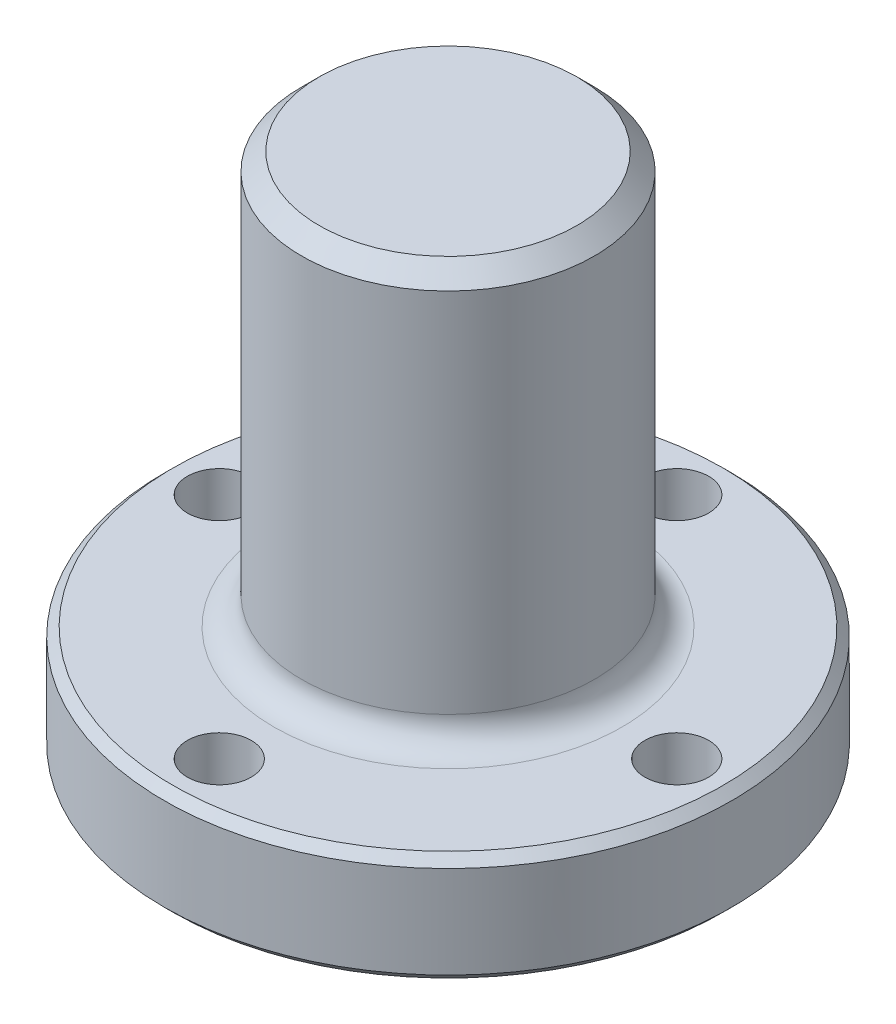
ISO-10303-21;
HEADER;
FILE_DESCRIPTION(('STEP AP214'),'2;1');
FILE_NAME('part.step','',(''),(''),'','','');
FILE_SCHEMA(('AUTOMOTIVE_DESIGN { 1 0 10303 214 1 1 1 1 }'));
ENDSEC;
DATA;
#1=APPLICATION_CONTEXT('core data for automotive mechanical design processes');
#2=APPLICATION_PROTOCOL_DEFINITION('international standard','automotive_design',2000,#1);
#3=PRODUCT_CONTEXT('',#1,'mechanical');
#4=PRODUCT('Part','Part','',(#3));
#5=PRODUCT_RELATED_PRODUCT_CATEGORY('part','',(#4));
#6=PRODUCT_DEFINITION_FORMATION('','',#4);
#7=PRODUCT_DEFINITION_CONTEXT('part definition',#1,'design');
#8=PRODUCT_DEFINITION('design','',#6,#7);
#9=PRODUCT_DEFINITION_SHAPE('','',#8);
#10=(LENGTH_UNIT() NAMED_UNIT(*) SI_UNIT(.MILLI.,.METRE.));
#11=(NAMED_UNIT(*) PLANE_ANGLE_UNIT() SI_UNIT($,.RADIAN.));
#12=(NAMED_UNIT(*) SI_UNIT($,.STERADIAN.) SOLID_ANGLE_UNIT());
#13=UNCERTAINTY_MEASURE_WITH_UNIT(LENGTH_MEASURE(1.E-05),#10,'distance_accuracy_value','');
#14=(GEOMETRIC_REPRESENTATION_CONTEXT(3) GLOBAL_UNCERTAINTY_ASSIGNED_CONTEXT((#13)) GLOBAL_UNIT_ASSIGNED_CONTEXT((#10,
#11,#12)) REPRESENTATION_CONTEXT('',''));
#15=CARTESIAN_POINT('',(0.,0.,0.));
#16=DIRECTION('',(0.,0.,1.));
#17=DIRECTION('',(1.,0.,0.));
#18=AXIS2_PLACEMENT_3D('',#15,#16,#17);
#19=CARTESIAN_POINT('',(0.,-25.0317,0.));
#20=DIRECTION('',(0.,1.,0.));
#21=DIRECTION('',(0.,0.,1.));
#22=AXIS2_PLACEMENT_3D('',#19,#20,#21);
#23=PLANE('',#22);
#24=CARTESIAN_POINT('',(0.,-25.0317,0.));
#25=DIRECTION('',(0.,1.,0.));
#26=DIRECTION('',(0.,0.,1.));
#27=AXIS2_PLACEMENT_3D('',#24,#25,#26);
#28=CIRCLE('',#27,7.95020000000003);
#29=CARTESIAN_POINT('',(0.,-25.0317,7.95020000000003));
#30=VERTEX_POINT('',#29);
#31=EDGE_CURVE('E59',#30,#30,#28,.F.);
#32=ORIENTED_EDGE('',*,*,#31,.T.);
#33=EDGE_LOOP('',(#32));
#34=FACE_BOUND('',#33,.T.);
#35=ADVANCED_FACE('F43',(#34),#23,.F.);
#36=CARTESIAN_POINT('',(0.,-50.4317,0.));
#37=DIRECTION('',(0.,-1.,0.));
#38=DIRECTION('',(0.,0.,-1.));
#39=AXIS2_PLACEMENT_3D('',#36,#37,#38);
#40=CYLINDRICAL_SURFACE('',#39,8.7122);
#41=CARTESIAN_POINT('',(0.,-24.2697,0.));
#42=DIRECTION('',(0.,1.,0.));
#43=DIRECTION('',(0.,0.,1.));
#44=AXIS2_PLACEMENT_3D('',#41,#42,#43);
#45=CIRCLE('',#44,8.7122);
#46=CARTESIAN_POINT('',(0.,-24.2697,8.7122));
#47=VERTEX_POINT('',#46);
#48=EDGE_CURVE('E55',#47,#47,#45,.T.);
#49=ORIENTED_EDGE('',*,*,#48,.T.);
#50=EDGE_LOOP('',(#49));
#51=FACE_BOUND('',#50,.T.);
#52=CARTESIAN_POINT('',(0.,-20.2057,0.));
#53=DIRECTION('',(0.,-1.,0.));
#54=DIRECTION('',(0.,0.,-1.));
#55=AXIS2_PLACEMENT_3D('',#52,#53,#54);
#56=CIRCLE('',#55,8.7122);
#57=CARTESIAN_POINT('',(0.,-20.2057,-8.7122));
#58=VERTEX_POINT('',#57);
#59=EDGE_CURVE('E82',#58,#58,#56,.T.);
#60=ORIENTED_EDGE('',*,*,#59,.T.);
#61=EDGE_LOOP('',(#60));
#62=FACE_BOUND('',#61,.T.);
#63=ADVANCED_FACE('F146',(#51,#62),#40,.T.);
#64=CARTESIAN_POINT('',(-8.7122,-20.2057,0.));
#65=DIRECTION('',(0.,1.,0.));
#66=DIRECTION('',(0.,0.,1.));
#67=AXIS2_PLACEMENT_3D('',#64,#65,#66);
#68=PLANE('',#67);
#69=CARTESIAN_POINT('',(-19.8374,-20.2057,0.));
#70=DIRECTION('',(0.,1.,0.));
#71=DIRECTION('',(0.,0.,1.));
#72=AXIS2_PLACEMENT_3D('',#69,#70,#71);
#73=CIRCLE('',#72,2.7686);
#74=CARTESIAN_POINT('',(-19.8374,-20.2057,2.7686));
#75=VERTEX_POINT('',#74);
#76=EDGE_CURVE('E85',#75,#75,#73,.F.);
#77=ORIENTED_EDGE('',*,*,#76,.F.);
#78=EDGE_LOOP('',(#77));
#79=FACE_BOUND('',#78,.T.);
#80=CARTESIAN_POINT('',(0.,-20.2057,19.8374));
#81=DIRECTION('',(0.,1.,0.));
#82=DIRECTION('',(0.,0.,1.));
#83=AXIS2_PLACEMENT_3D('',#80,#81,#82);
#84=CIRCLE('',#83,2.7686);
#85=CARTESIAN_POINT('',(0.,-20.2057,22.606));
#86=VERTEX_POINT('',#85);
#87=EDGE_CURVE('E96',#86,#86,#84,.F.);
#88=ORIENTED_EDGE('',*,*,#87,.F.);
#89=EDGE_LOOP('',(#88));
#90=FACE_BOUND('',#89,.T.);
#91=CARTESIAN_POINT('',(19.8374,-20.2057,0.));
#92=DIRECTION('',(0.,1.,0.));
#93=DIRECTION('',(0.,0.,1.));
#94=AXIS2_PLACEMENT_3D('',#91,#92,#93);
#95=CIRCLE('',#94,2.7686);
#96=CARTESIAN_POINT('',(19.8374,-20.2057,2.7686));
#97=VERTEX_POINT('',#96);
#98=EDGE_CURVE('E89',#97,#97,#95,.F.);
#99=ORIENTED_EDGE('',*,*,#98,.F.);
#100=EDGE_LOOP('',(#99));
#101=FACE_BOUND('',#100,.T.);
#102=CARTESIAN_POINT('',(0.,-20.2057,-19.8374));
#103=DIRECTION('',(0.,1.,0.));
#104=DIRECTION('',(0.,0.,1.));
#105=AXIS2_PLACEMENT_3D('',#102,#103,#104);
#106=CIRCLE('',#105,2.7686);
#107=CARTESIAN_POINT('',(0.,-20.2057,-17.0688));
#108=VERTEX_POINT('',#107);
#109=EDGE_CURVE('E90',#108,#108,#106,.F.);
#110=ORIENTED_EDGE('',*,*,#109,.F.);
#111=EDGE_LOOP('',(#110));
#112=FACE_BOUND('',#111,.T.);
#113=CARTESIAN_POINT('',(0.,-20.2057,0.));
#114=DIRECTION('',(0.,1.,0.));
#115=DIRECTION('',(0.,0.,1.));
#116=AXIS2_PLACEMENT_3D('',#113,#114,#115);
#117=CIRCLE('',#116,23.8506);
#118=CARTESIAN_POINT('',(0.,-20.2057,23.8506));
#119=VERTEX_POINT('',#118);
#120=EDGE_CURVE('E64',#119,#119,#117,.F.);
#121=ORIENTED_EDGE('',*,*,#120,.T.);
#122=EDGE_LOOP('',(#121));
#123=FACE_BOUND('',#122,.T.);
#124=ORIENTED_EDGE('',*,*,#59,.F.);
#125=EDGE_LOOP('',(#124));
#126=FACE_BOUND('',#125,.T.);
#127=ADVANCED_FACE('F151',(#79,#90,#101,#112,#123,#126),#68,.F.);
#128=CARTESIAN_POINT('',(0.,-50.4317,0.));
#129=DIRECTION('',(0.,-1.,0.));
#130=DIRECTION('',(0.,0.,-1.));
#131=AXIS2_PLACEMENT_3D('',#128,#129,#130);
#132=CYLINDRICAL_SURFACE('',#131,24.6126);
#133=CARTESIAN_POINT('',(0.,-11.4427,0.));
#134=DIRECTION('',(0.,-1.,0.));
#135=DIRECTION('',(0.,0.,-1.));
#136=AXIS2_PLACEMENT_3D('',#133,#134,#135);
#137=CIRCLE('',#136,24.6126);
#138=CARTESIAN_POINT('',(0.,-11.4427,-24.6126));
#139=VERTEX_POINT('',#138);
#140=EDGE_CURVE('E70',#139,#139,#137,.T.);
#141=ORIENTED_EDGE('',*,*,#140,.T.);
#142=EDGE_LOOP('',(#141));
#143=FACE_BOUND('',#142,.T.);
#144=CARTESIAN_POINT('',(0.,-19.4437,0.));
#145=DIRECTION('',(0.,1.,0.));
#146=DIRECTION('',(0.,0.,1.));
#147=AXIS2_PLACEMENT_3D('',#144,#145,#146);
#148=CIRCLE('',#147,24.6126);
#149=CARTESIAN_POINT('',(0.,-19.4437,24.6126));
#150=VERTEX_POINT('',#149);
#151=EDGE_CURVE('E73',#150,#150,#148,.T.);
#152=ORIENTED_EDGE('',*,*,#151,.T.);
#153=EDGE_LOOP('',(#152));
#154=FACE_BOUND('',#153,.T.);
#155=ADVANCED_FACE('F117',(#143,#154),#132,.T.);
#156=CARTESIAN_POINT('',(-24.6126,-10.6807,0.));
#157=DIRECTION('',(0.,-1.,0.));
#158=DIRECTION('',(0.,0.,-1.));
#159=AXIS2_PLACEMENT_3D('',#156,#157,#158);
#160=PLANE('',#159);
#161=CARTESIAN_POINT('',(-19.8374,-10.6807,0.));
#162=DIRECTION('',(0.,1.,0.));
#163=DIRECTION('',(0.,0.,1.));
#164=AXIS2_PLACEMENT_3D('',#161,#162,#163);
#165=CIRCLE('',#164,2.7686);
#166=CARTESIAN_POINT('',(-19.8374,-10.6807,2.7686));
#167=VERTEX_POINT('',#166);
#168=EDGE_CURVE('E102',#167,#167,#165,.T.);
#169=ORIENTED_EDGE('',*,*,#168,.F.);
#170=EDGE_LOOP('',(#169));
#171=FACE_BOUND('',#170,.T.);
#172=CARTESIAN_POINT('',(0.,-10.6807,19.8374));
#173=DIRECTION('',(0.,1.,0.));
#174=DIRECTION('',(0.,0.,1.));
#175=AXIS2_PLACEMENT_3D('',#172,#173,#174);
#176=CIRCLE('',#175,2.7686);
#177=CARTESIAN_POINT('',(0.,-10.6807,22.606));
#178=VERTEX_POINT('',#177);
#179=EDGE_CURVE('E99',#178,#178,#176,.T.);
#180=ORIENTED_EDGE('',*,*,#179,.F.);
#181=EDGE_LOOP('',(#180));
#182=FACE_BOUND('',#181,.T.);
#183=CARTESIAN_POINT('',(19.8374,-10.6807,0.));
#184=DIRECTION('',(0.,1.,0.));
#185=DIRECTION('',(0.,0.,1.));
#186=AXIS2_PLACEMENT_3D('',#183,#184,#185);
#187=CIRCLE('',#186,2.7686);
#188=CARTESIAN_POINT('',(19.8374,-10.6807,2.7686));
#189=VERTEX_POINT('',#188);
#190=EDGE_CURVE('E93',#189,#189,#187,.T.);
#191=ORIENTED_EDGE('',*,*,#190,.F.);
#192=EDGE_LOOP('',(#191));
#193=FACE_BOUND('',#192,.T.);
#194=CARTESIAN_POINT('',(0.,-10.6807,-19.8374));
#195=DIRECTION('',(0.,1.,0.));
#196=DIRECTION('',(0.,0.,1.));
#197=AXIS2_PLACEMENT_3D('',#194,#195,#196);
#198=CIRCLE('',#197,2.7686);
#199=CARTESIAN_POINT('',(0.,-10.6807,-17.0688));
#200=VERTEX_POINT('',#199);
#201=EDGE_CURVE('E86',#200,#200,#198,.T.);
#202=ORIENTED_EDGE('',*,*,#201,.F.);
#203=EDGE_LOOP('',(#202));
#204=FACE_BOUND('',#203,.T.);
#205=CARTESIAN_POINT('',(0.,-10.6807,0.));
#206=DIRECTION('',(0.,-1.,0.));
#207=DIRECTION('',(0.,0.,-1.));
#208=AXIS2_PLACEMENT_3D('',#205,#206,#207);
#209=CIRCLE('',#208,23.8506);
#210=CARTESIAN_POINT('',(0.,-10.6807,-23.8506));
#211=VERTEX_POINT('',#210);
#212=EDGE_CURVE('E67',#211,#211,#209,.F.);
#213=ORIENTED_EDGE('',*,*,#212,.T.);
#214=EDGE_LOOP('',(#213));
#215=FACE_BOUND('',#214,.T.);
#216=CARTESIAN_POINT('',(0.,-10.6807,0.));
#217=DIRECTION('',(0.,-1.,0.));
#218=DIRECTION('',(0.,0.,-1.));
#219=AXIS2_PLACEMENT_3D('',#216,#217,#218);
#220=CIRCLE('',#219,15.0876);
#221=CARTESIAN_POINT('',(0.,-10.6807,-15.0876));
#222=VERTEX_POINT('',#221);
#223=EDGE_CURVE('E79',#222,#222,#220,.T.);
#224=ORIENTED_EDGE('',*,*,#223,.T.);
#225=EDGE_LOOP('',(#224));
#226=FACE_BOUND('',#225,.T.);
#227=ADVANCED_FACE('F113',(#171,#182,#193,#204,#215,#226),#160,.F.);
#228=CARTESIAN_POINT('',(0.,-50.4317,0.));
#229=DIRECTION('',(0.,-1.,0.));
#230=DIRECTION('',(0.,0.,-1.));
#231=AXIS2_PLACEMENT_3D('',#228,#229,#230);
#232=CYLINDRICAL_SURFACE('',#231,12.7);
#233=CARTESIAN_POINT('',(0.,23.5077,0.));
#234=DIRECTION('',(0.,-1.,0.));
#235=DIRECTION('',(0.,0.,-1.));
#236=AXIS2_PLACEMENT_3D('',#233,#234,#235);
#237=CIRCLE('',#236,12.7);
#238=CARTESIAN_POINT('',(0.,23.5077,-12.7));
#239=VERTEX_POINT('',#238);
#240=EDGE_CURVE('E51',#239,#239,#237,.T.);
#241=ORIENTED_EDGE('',*,*,#240,.T.);
#242=EDGE_LOOP('',(#241));
#243=FACE_BOUND('',#242,.T.);
#244=CARTESIAN_POINT('',(0.,-8.2931,0.));
#245=DIRECTION('',(0.,-1.,0.));
#246=DIRECTION('',(0.,0.,-1.));
#247=AXIS2_PLACEMENT_3D('',#244,#245,#246);
#248=CIRCLE('',#247,12.7);
#249=CARTESIAN_POINT('',(0.,-8.2931,-12.7));
#250=VERTEX_POINT('',#249);
#251=EDGE_CURVE('E76',#250,#250,#248,.F.);
#252=ORIENTED_EDGE('',*,*,#251,.T.);
#253=EDGE_LOOP('',(#252));
#254=FACE_BOUND('',#253,.T.);
#255=ADVANCED_FACE('F116',(#243,#254),#232,.T.);
#256=CARTESIAN_POINT('',(-12.7,25.0317,0.));
#257=DIRECTION('',(0.,-1.,0.));
#258=DIRECTION('',(0.,0.,-1.));
#259=AXIS2_PLACEMENT_3D('',#256,#257,#258);
#260=PLANE('',#259);
#261=CARTESIAN_POINT('',(0.,25.0317,0.));
#262=DIRECTION('',(0.,-1.,0.));
#263=DIRECTION('',(0.,0.,-1.));
#264=AXIS2_PLACEMENT_3D('',#261,#262,#263);
#265=CIRCLE('',#264,11.176);
#266=CARTESIAN_POINT('',(0.,25.0317,-11.176));
#267=VERTEX_POINT('',#266);
#268=EDGE_CURVE('E10',#267,#267,#265,.F.);
#269=ORIENTED_EDGE('',*,*,#268,.T.);
#270=EDGE_LOOP('',(#269));
#271=FACE_BOUND('',#270,.T.);
#272=ADVANCED_FACE('F132',(#271),#260,.F.);
#273=CARTESIAN_POINT('',(0.,-8.2931,0.));
#274=DIRECTION('',(0.,-1.,0.));
#275=DIRECTION('',(0.,0.,-1.));
#276=AXIS2_PLACEMENT_3D('',#273,#274,#275);
#277=TOROIDAL_SURFACE('',#276,15.0876,2.3876);
#278=ORIENTED_EDGE('',*,*,#251,.F.);
#279=EDGE_LOOP('',(#278));
#280=FACE_BOUND('',#279,.T.);
#281=ORIENTED_EDGE('',*,*,#223,.F.);
#282=EDGE_LOOP('',(#281));
#283=FACE_BOUND('',#282,.T.);
#284=ADVANCED_FACE('F129',(#280,#283),#277,.F.);
#285=CARTESIAN_POINT('',(0.,-11.4427,0.));
#286=DIRECTION('',(0.,-1.,0.));
#287=DIRECTION('',(0.,0.,-1.));
#288=AXIS2_PLACEMENT_3D('',#285,#286,#287);
#289=CONICAL_SURFACE('',#288,24.6126,0.785398163397457);
#290=ORIENTED_EDGE('',*,*,#212,.F.);
#291=EDGE_LOOP('',(#290));
#292=FACE_BOUND('',#291,.T.);
#293=ORIENTED_EDGE('',*,*,#140,.F.);
#294=EDGE_LOOP('',(#293));
#295=FACE_BOUND('',#294,.T.);
#296=ADVANCED_FACE('F131',(#292,#295),#289,.T.);
#297=CARTESIAN_POINT('',(0.,-20.2057,0.));
#298=DIRECTION('',(0.,1.,0.));
#299=DIRECTION('',(0.,0.,1.));
#300=AXIS2_PLACEMENT_3D('',#297,#298,#299);
#301=CONICAL_SURFACE('',#300,23.8506,0.785398163397432);
#302=ORIENTED_EDGE('',*,*,#151,.F.);
#303=EDGE_LOOP('',(#302));
#304=FACE_BOUND('',#303,.T.);
#305=ORIENTED_EDGE('',*,*,#120,.F.);
#306=EDGE_LOOP('',(#305));
#307=FACE_BOUND('',#306,.T.);
#308=ADVANCED_FACE('F139',(#304,#307),#301,.T.);
#309=CARTESIAN_POINT('',(0.,-25.0317,0.));
#310=DIRECTION('',(0.,1.,0.));
#311=DIRECTION('',(0.,0.,1.));
#312=AXIS2_PLACEMENT_3D('',#309,#310,#311);
#313=CONICAL_SURFACE('',#312,7.95020000000003,0.785398163397446);
#314=ORIENTED_EDGE('',*,*,#48,.F.);
#315=EDGE_LOOP('',(#314));
#316=FACE_BOUND('',#315,.T.);
#317=ORIENTED_EDGE('',*,*,#31,.F.);
#318=EDGE_LOOP('',(#317));
#319=FACE_BOUND('',#318,.T.);
#320=ADVANCED_FACE('F212',(#316,#319),#313,.T.);
#321=CARTESIAN_POINT('',(0.,23.5077,0.));
#322=DIRECTION('',(0.,-1.,0.));
#323=DIRECTION('',(0.,0.,-1.));
#324=AXIS2_PLACEMENT_3D('',#321,#322,#323);
#325=CONICAL_SURFACE('',#324,12.7,0.785398163397454);
#326=ORIENTED_EDGE('',*,*,#268,.F.);
#327=EDGE_LOOP('',(#326));
#328=FACE_BOUND('',#327,.T.);
#329=ORIENTED_EDGE('',*,*,#240,.F.);
#330=EDGE_LOOP('',(#329));
#331=FACE_BOUND('',#330,.T.);
#332=ADVANCED_FACE('F46',(#328,#331),#325,.T.);
#333=CARTESIAN_POINT('',(0.,-25.0317,-19.8374));
#334=DIRECTION('',(0.,1.,0.));
#335=DIRECTION('',(0.,0.,1.));
#336=AXIS2_PLACEMENT_3D('',#333,#334,#335);
#337=CYLINDRICAL_SURFACE('',#336,2.7686);
#338=ORIENTED_EDGE('',*,*,#201,.T.);
#339=EDGE_LOOP('',(#338));
#340=FACE_BOUND('',#339,.T.);
#341=ORIENTED_EDGE('',*,*,#109,.T.);
#342=EDGE_LOOP('',(#341));
#343=FACE_BOUND('',#342,.T.);
#344=ADVANCED_FACE('F163',(#340,#343),#337,.F.);
#345=CARTESIAN_POINT('',(19.8374,-25.0317,0.));
#346=DIRECTION('',(0.,1.,0.));
#347=DIRECTION('',(0.,0.,1.));
#348=AXIS2_PLACEMENT_3D('',#345,#346,#347);
#349=CYLINDRICAL_SURFACE('',#348,2.7686);
#350=ORIENTED_EDGE('',*,*,#190,.T.);
#351=EDGE_LOOP('',(#350));
#352=FACE_BOUND('',#351,.T.);
#353=ORIENTED_EDGE('',*,*,#98,.T.);
#354=EDGE_LOOP('',(#353));
#355=FACE_BOUND('',#354,.T.);
#356=ADVANCED_FACE('F166',(#352,#355),#349,.F.);
#357=CARTESIAN_POINT('',(0.,-25.0317,19.8374));
#358=DIRECTION('',(0.,1.,0.));
#359=DIRECTION('',(0.,0.,1.));
#360=AXIS2_PLACEMENT_3D('',#357,#358,#359);
#361=CYLINDRICAL_SURFACE('',#360,2.7686);
#362=ORIENTED_EDGE('',*,*,#179,.T.);
#363=EDGE_LOOP('',(#362));
#364=FACE_BOUND('',#363,.T.);
#365=ORIENTED_EDGE('',*,*,#87,.T.);
#366=EDGE_LOOP('',(#365));
#367=FACE_BOUND('',#366,.T.);
#368=ADVANCED_FACE('F170',(#364,#367),#361,.F.);
#369=CARTESIAN_POINT('',(-19.8374,-25.0317,0.));
#370=DIRECTION('',(0.,1.,0.));
#371=DIRECTION('',(0.,0.,1.));
#372=AXIS2_PLACEMENT_3D('',#369,#370,#371);
#373=CYLINDRICAL_SURFACE('',#372,2.7686);
#374=ORIENTED_EDGE('',*,*,#168,.T.);
#375=EDGE_LOOP('',(#374));
#376=FACE_BOUND('',#375,.T.);
#377=ORIENTED_EDGE('',*,*,#76,.T.);
#378=EDGE_LOOP('',(#377));
#379=FACE_BOUND('',#378,.T.);
#380=ADVANCED_FACE('F110',(#376,#379),#373,.F.);
#381=CLOSED_SHELL('',(#35,#63,#127,#155,#227,#255,#272,#284,#296,#308,#320,#332,#344,#356,#368,#380));
#382=MANIFOLD_SOLID_BREP('B2',#381);
#383=ADVANCED_BREP_SHAPE_REPRESENTATION('',(#18,#382),#14);
#384=SHAPE_DEFINITION_REPRESENTATION(#9,#383);
ENDSEC;
END-ISO-10303-21;
